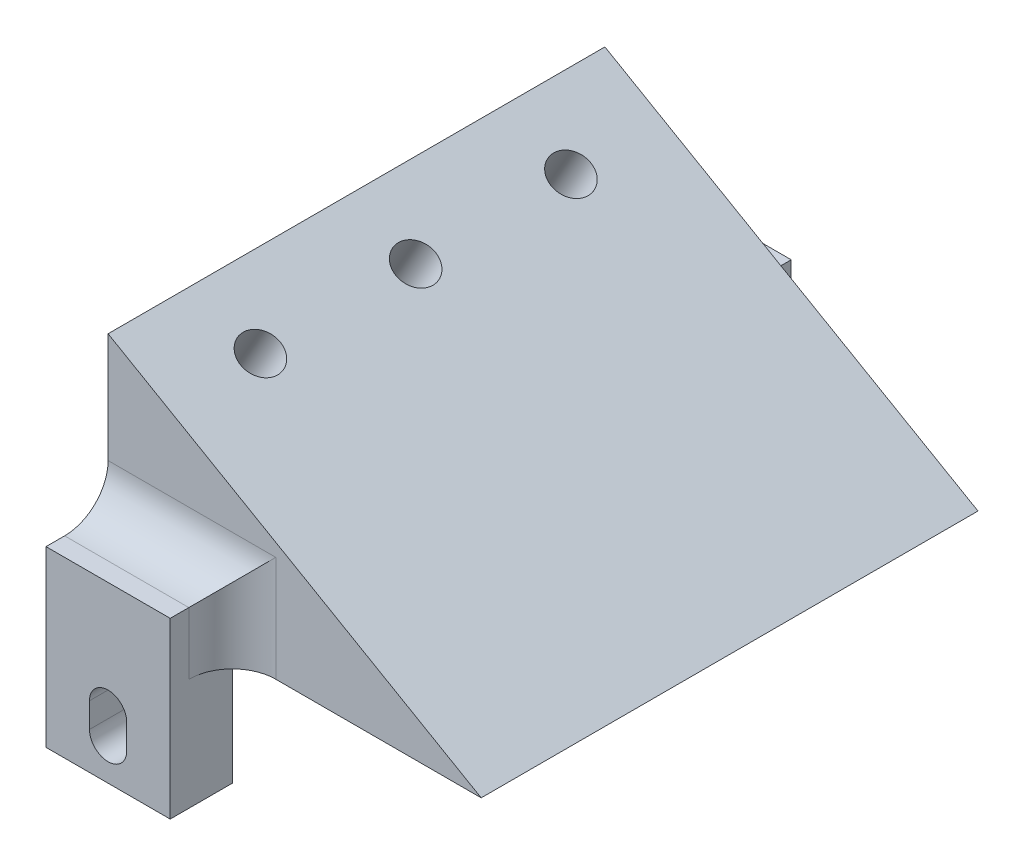
ISO-10303-21;
HEADER;
FILE_DESCRIPTION(('STEP AP214'),'2;1');
FILE_NAME('part.step','',(''),(''),'','','');
FILE_SCHEMA(('AUTOMOTIVE_DESIGN { 1 0 10303 214 1 1 1 1 }'));
ENDSEC;
DATA;
#1=APPLICATION_CONTEXT('core data for automotive mechanical design processes');
#2=APPLICATION_PROTOCOL_DEFINITION('international standard','automotive_design',2000,#1);
#3=PRODUCT_CONTEXT('',#1,'mechanical');
#4=PRODUCT('Part','Part','',(#3));
#5=PRODUCT_RELATED_PRODUCT_CATEGORY('part','',(#4));
#6=PRODUCT_DEFINITION_FORMATION('','',#4);
#7=PRODUCT_DEFINITION_CONTEXT('part definition',#1,'design');
#8=PRODUCT_DEFINITION('design','',#6,#7);
#9=PRODUCT_DEFINITION_SHAPE('','',#8);
#10=(LENGTH_UNIT() NAMED_UNIT(*) SI_UNIT(.MILLI.,.METRE.));
#11=(NAMED_UNIT(*) PLANE_ANGLE_UNIT() SI_UNIT($,.RADIAN.));
#12=(NAMED_UNIT(*) SI_UNIT($,.STERADIAN.) SOLID_ANGLE_UNIT());
#13=UNCERTAINTY_MEASURE_WITH_UNIT(LENGTH_MEASURE(1.E-05),#10,'distance_accuracy_value','');
#14=(GEOMETRIC_REPRESENTATION_CONTEXT(3) GLOBAL_UNCERTAINTY_ASSIGNED_CONTEXT((#13)) GLOBAL_UNIT_ASSIGNED_CONTEXT((#10,
#11,#12)) REPRESENTATION_CONTEXT('',''));
#15=CARTESIAN_POINT('',(0.,0.,0.));
#16=DIRECTION('',(0.,0.,1.));
#17=DIRECTION('',(1.,0.,0.));
#18=AXIS2_PLACEMENT_3D('',#15,#16,#17);
#19=CARTESIAN_POINT('',(0.,0.,0.));
#20=DIRECTION('',(0.,0.,1.));
#21=DIRECTION('',(-1.,0.,0.));
#22=AXIS2_PLACEMENT_3D('',#19,#20,#21);
#23=PLANE('',#22);
#24=DIRECTION('',(1.,0.,0.));
#25=VECTOR('',#24,1.);
#26=CARTESIAN_POINT('',(60.076767482881,0.,0.));
#27=LINE('',#26,#25);
#28=CARTESIAN_POINT('',(0.,0.,0.));
#29=VERTEX_POINT('',#28);
#30=CARTESIAN_POINT('',(20.,0.,0.));
#31=VERTEX_POINT('',#30);
#32=EDGE_CURVE('E331',#29,#31,#27,.T.);
#33=ORIENTED_EDGE('',*,*,#32,.F.);
#34=DIRECTION('',(0.,-1.,0.));
#35=VECTOR('',#34,1.);
#36=CARTESIAN_POINT('',(0.,10.,0.));
#37=LINE('',#36,#35);
#38=CARTESIAN_POINT('',(0.,-18.,0.));
#39=VERTEX_POINT('',#38);
#40=EDGE_CURVE('E241',#29,#39,#37,.T.);
#41=ORIENTED_EDGE('',*,*,#40,.T.);
#42=DIRECTION('',(1.,0.,0.));
#43=VECTOR('',#42,1.);
#44=CARTESIAN_POINT('',(20.,-18.,0.));
#45=LINE('',#44,#43);
#46=CARTESIAN_POINT('',(20.,-18.,0.));
#47=VERTEX_POINT('',#46);
#48=EDGE_CURVE('E246',#39,#47,#45,.T.);
#49=ORIENTED_EDGE('',*,*,#48,.T.);
#50=DIRECTION('',(0.,1.,0.));
#51=VECTOR('',#50,1.);
#52=CARTESIAN_POINT('',(20.,10.,0.));
#53=LINE('',#52,#51);
#54=EDGE_CURVE('E257',#47,#31,#53,.T.);
#55=ORIENTED_EDGE('',*,*,#54,.T.);
#56=EDGE_LOOP('',(#33,#41,#49,#55));
#57=FACE_BOUND('',#56,.T.);
#58=DIRECTION('',(0.,-1.,0.));
#59=VECTOR('',#58,1.);
#60=CARTESIAN_POINT('',(13.,0.,0.));
#61=LINE('',#60,#59);
#62=CARTESIAN_POINT('',(13.,-8.,0.));
#63=VERTEX_POINT('',#62);
#64=CARTESIAN_POINT('',(13.,-12.,0.));
#65=VERTEX_POINT('',#64);
#66=EDGE_CURVE('E235',#63,#65,#61,.T.);
#67=ORIENTED_EDGE('',*,*,#66,.T.);
#68=CARTESIAN_POINT('',(10.,-12.,0.));
#69=DIRECTION('',(0.,0.,1.));
#70=DIRECTION('',(1.,0.,0.));
#71=AXIS2_PLACEMENT_3D('',#68,#69,#70);
#72=CIRCLE('',#71,3.);
#73=CARTESIAN_POINT('',(7.,-12.,0.));
#74=VERTEX_POINT('',#73);
#75=EDGE_CURVE('E238',#65,#74,#72,.F.);
#76=ORIENTED_EDGE('',*,*,#75,.T.);
#77=DIRECTION('',(0.,1.,0.));
#78=VECTOR('',#77,1.);
#79=CARTESIAN_POINT('',(7.,0.,0.));
#80=LINE('',#79,#78);
#81=CARTESIAN_POINT('',(7.,-8.,0.));
#82=VERTEX_POINT('',#81);
#83=EDGE_CURVE('E230',#74,#82,#80,.T.);
#84=ORIENTED_EDGE('',*,*,#83,.T.);
#85=CARTESIAN_POINT('',(10.,-8.,0.));
#86=DIRECTION('',(0.,0.,1.));
#87=DIRECTION('',(1.,0.,0.));
#88=AXIS2_PLACEMENT_3D('',#85,#86,#87);
#89=CIRCLE('',#88,3.);
#90=EDGE_CURVE('E206',#82,#63,#89,.F.);
#91=ORIENTED_EDGE('',*,*,#90,.T.);
#92=EDGE_LOOP('',(#67,#76,#84,#91));
#93=FACE_BOUND('',#92,.T.);
#94=ADVANCED_FACE('F37',(#57,#93),#23,.T.);
#95=CARTESIAN_POINT('',(0.,0.,-10.));
#96=DIRECTION('',(0.,0.,1.));
#97=DIRECTION('',(-1.,0.,0.));
#98=AXIS2_PLACEMENT_3D('',#95,#96,#97);
#99=PLANE('',#98);
#100=DIRECTION('',(0.,-1.,0.));
#101=VECTOR('',#100,1.);
#102=CARTESIAN_POINT('',(0.,10.,-10.));
#103=LINE('',#102,#101);
#104=CARTESIAN_POINT('',(0.,10.,-10.));
#105=VERTEX_POINT('',#104);
#106=CARTESIAN_POINT('',(0.,-18.,-10.));
#107=VERTEX_POINT('',#106);
#108=EDGE_CURVE('E242',#105,#107,#103,.T.);
#109=ORIENTED_EDGE('',*,*,#108,.F.);
#110=DIRECTION('',(-1.,0.,0.));
#111=VECTOR('',#110,1.);
#112=CARTESIAN_POINT('',(20.,10.,-10.));
#113=LINE('',#112,#111);
#114=CARTESIAN_POINT('',(20.,10.,-10.));
#115=VERTEX_POINT('',#114);
#116=EDGE_CURVE('E245',#115,#105,#113,.T.);
#117=ORIENTED_EDGE('',*,*,#116,.F.);
#118=DIRECTION('',(0.,1.,0.));
#119=VECTOR('',#118,1.);
#120=CARTESIAN_POINT('',(20.,10.,-10.));
#121=LINE('',#120,#119);
#122=CARTESIAN_POINT('',(20.,-18.,-10.));
#123=VERTEX_POINT('',#122);
#124=EDGE_CURVE('E249',#123,#115,#121,.T.);
#125=ORIENTED_EDGE('',*,*,#124,.F.);
#126=DIRECTION('',(1.,0.,0.));
#127=VECTOR('',#126,1.);
#128=CARTESIAN_POINT('',(20.,-18.,-10.));
#129=LINE('',#128,#127);
#130=EDGE_CURVE('E252',#107,#123,#129,.T.);
#131=ORIENTED_EDGE('',*,*,#130,.F.);
#132=EDGE_LOOP('',(#109,#117,#125,#131));
#133=FACE_BOUND('',#132,.T.);
#134=CARTESIAN_POINT('',(10.,-12.,-9.99999999999999));
#135=DIRECTION('',(0.,0.,1.));
#136=DIRECTION('',(1.,0.,0.));
#137=AXIS2_PLACEMENT_3D('',#134,#135,#136);
#138=CIRCLE('',#137,3.);
#139=CARTESIAN_POINT('',(7.,-12.,-10.));
#140=VERTEX_POINT('',#139);
#141=CARTESIAN_POINT('',(13.,-12.,-9.99999999999999));
#142=VERTEX_POINT('',#141);
#143=EDGE_CURVE('E219',#140,#142,#138,.T.);
#144=ORIENTED_EDGE('',*,*,#143,.T.);
#145=DIRECTION('',(0.,1.,0.));
#146=VECTOR('',#145,1.);
#147=CARTESIAN_POINT('',(13.,-12.,-9.99999999999999));
#148=LINE('',#147,#146);
#149=CARTESIAN_POINT('',(13.,-8.,-9.99999999999999));
#150=VERTEX_POINT('',#149);
#151=EDGE_CURVE('E223',#142,#150,#148,.T.);
#152=ORIENTED_EDGE('',*,*,#151,.T.);
#153=CARTESIAN_POINT('',(10.,-8.,-9.99999999999999));
#154=DIRECTION('',(0.,0.,1.));
#155=DIRECTION('',(1.,0.,0.));
#156=AXIS2_PLACEMENT_3D('',#153,#154,#155);
#157=CIRCLE('',#156,3.);
#158=CARTESIAN_POINT('',(7.,-8.,-9.99999999999999));
#159=VERTEX_POINT('',#158);
#160=EDGE_CURVE('E203',#150,#159,#157,.T.);
#161=ORIENTED_EDGE('',*,*,#160,.T.);
#162=DIRECTION('',(0.,-1.,0.));
#163=VECTOR('',#162,1.);
#164=CARTESIAN_POINT('',(7.,-12.,-9.99999999999999));
#165=LINE('',#164,#163);
#166=EDGE_CURVE('E214',#159,#140,#165,.T.);
#167=ORIENTED_EDGE('',*,*,#166,.T.);
#168=EDGE_LOOP('',(#144,#152,#161,#167));
#169=FACE_BOUND('',#168,.T.);
#170=ADVANCED_FACE('F221',(#133,#169),#99,.F.);
#171=CARTESIAN_POINT('',(0.,0.,0.));
#172=DIRECTION('',(0.,0.,-1.));
#173=DIRECTION('',(-1.,0.,0.));
#174=AXIS2_PLACEMENT_3D('',#171,#172,#173);
#175=PLANE('',#174);
#176=CARTESIAN_POINT('',(27.,0.,0.));
#177=VERTEX_POINT('',#176);
#178=CARTESIAN_POINT('',(60.076767482881,0.,0.));
#179=VERTEX_POINT('',#178);
#180=EDGE_CURVE('E320',#177,#179,#27,.T.);
#181=ORIENTED_EDGE('',*,*,#180,.F.);
#182=DIRECTION('',(0.,1.,0.));
#183=VECTOR('',#182,1.);
#184=CARTESIAN_POINT('',(27.,10.,0.));
#185=LINE('',#184,#183);
#186=CARTESIAN_POINT('',(27.,17.,0.));
#187=VERTEX_POINT('',#186);
#188=EDGE_CURVE('E373',#177,#187,#185,.T.);
#189=ORIENTED_EDGE('',*,*,#188,.T.);
#190=DIRECTION('',(-1.,0.,0.));
#191=VECTOR('',#190,1.);
#192=CARTESIAN_POINT('',(0.,17.,0.));
#193=LINE('',#192,#191);
#194=CARTESIAN_POINT('',(0.,17.,0.));
#195=VERTEX_POINT('',#194);
#196=EDGE_CURVE('E371',#187,#195,#193,.T.);
#197=ORIENTED_EDGE('',*,*,#196,.T.);
#198=DIRECTION('',(0.,-1.,0.));
#199=VECTOR('',#198,1.);
#200=CARTESIAN_POINT('',(0.,0.,0.));
#201=LINE('',#200,#199);
#202=CARTESIAN_POINT('',(0.,34.6853378782834,0.));
#203=VERTEX_POINT('',#202);
#204=EDGE_CURVE('E335',#203,#195,#201,.T.);
#205=ORIENTED_EDGE('',*,*,#204,.F.);
#206=DIRECTION('',(-0.866025403784442,0.499999999999995,0.));
#207=VECTOR('',#206,1.);
#208=CARTESIAN_POINT('',(0.,34.6853378782834,0.));
#209=LINE('',#208,#207);
#210=EDGE_CURVE('E333',#179,#203,#209,.T.);
#211=ORIENTED_EDGE('',*,*,#210,.F.);
#212=EDGE_LOOP('',(#181,#189,#197,#205,#211));
#213=FACE_BOUND('',#212,.T.);
#214=ADVANCED_FACE('F390',(#213),#175,.T.);
#215=CARTESIAN_POINT('',(0.,0.,80.));
#216=DIRECTION('',(0.,0.,-1.));
#217=DIRECTION('',(-1.,0.,0.));
#218=AXIS2_PLACEMENT_3D('',#215,#216,#217);
#219=PLANE('',#218);
#220=DIRECTION('',(-1.,0.,0.));
#221=VECTOR('',#220,1.);
#222=CARTESIAN_POINT('',(20.,17.,80.));
#223=LINE('',#222,#221);
#224=CARTESIAN_POINT('',(0.,17.,80.));
#225=VERTEX_POINT('',#224);
#226=CARTESIAN_POINT('',(27.,17.,80.));
#227=VERTEX_POINT('',#226);
#228=EDGE_CURVE('E351',#225,#227,#223,.F.);
#229=ORIENTED_EDGE('',*,*,#228,.T.);
#230=DIRECTION('',(0.,1.,0.));
#231=VECTOR('',#230,1.);
#232=CARTESIAN_POINT('',(27.,0.,80.));
#233=LINE('',#232,#231);
#234=CARTESIAN_POINT('',(27.,0.,80.));
#235=VERTEX_POINT('',#234);
#236=EDGE_CURVE('E353',#227,#235,#233,.F.);
#237=ORIENTED_EDGE('',*,*,#236,.T.);
#238=DIRECTION('',(1.,0.,0.));
#239=VECTOR('',#238,1.);
#240=CARTESIAN_POINT('',(60.076767482881,0.,80.));
#241=LINE('',#240,#239);
#242=CARTESIAN_POINT('',(60.076767482881,0.,80.));
#243=VERTEX_POINT('',#242);
#244=EDGE_CURVE('E325',#235,#243,#241,.T.);
#245=ORIENTED_EDGE('',*,*,#244,.T.);
#246=DIRECTION('',(-0.866025403784442,0.499999999999995,0.));
#247=VECTOR('',#246,1.);
#248=CARTESIAN_POINT('',(0.,34.6853378782834,80.));
#249=LINE('',#248,#247);
#250=CARTESIAN_POINT('',(0.,34.6853378782834,80.));
#251=VERTEX_POINT('',#250);
#252=EDGE_CURVE('E324',#243,#251,#249,.T.);
#253=ORIENTED_EDGE('',*,*,#252,.T.);
#254=DIRECTION('',(0.,-1.,0.));
#255=VECTOR('',#254,1.);
#256=CARTESIAN_POINT('',(0.,0.,80.));
#257=LINE('',#256,#255);
#258=EDGE_CURVE('E327',#251,#225,#257,.T.);
#259=ORIENTED_EDGE('',*,*,#258,.T.);
#260=EDGE_LOOP('',(#229,#237,#245,#253,#259));
#261=FACE_BOUND('',#260,.T.);
#262=ADVANCED_FACE('F530',(#261),#219,.F.);
#263=CARTESIAN_POINT('',(60.076767482881,0.,80.));
#264=DIRECTION('',(0.,1.,0.));
#265=DIRECTION('',(0.,0.,1.));
#266=AXIS2_PLACEMENT_3D('',#263,#264,#265);
#267=PLANE('',#266);
#268=ORIENTED_EDGE('',*,*,#32,.T.);
#269=DIRECTION('',(0.,0.,1.));
#270=VECTOR('',#269,1.);
#271=CARTESIAN_POINT('',(20.,0.,-10.));
#272=LINE('',#271,#270);
#273=CARTESIAN_POINT('',(20.,0.,-7.));
#274=VERTEX_POINT('',#273);
#275=EDGE_CURVE('E59',#274,#31,#272,.T.);
#276=ORIENTED_EDGE('',*,*,#275,.F.);
#277=CARTESIAN_POINT('',(27.,0.,-7.));
#278=DIRECTION('',(0.,1.,0.));
#279=DIRECTION('',(0.,0.,1.));
#280=AXIS2_PLACEMENT_3D('',#277,#278,#279);
#281=CIRCLE('',#280,7.);
#282=EDGE_CURVE('E46',#274,#177,#281,.T.);
#283=ORIENTED_EDGE('',*,*,#282,.T.);
#284=ORIENTED_EDGE('',*,*,#180,.T.);
#285=DIRECTION('',(0.,0.,-1.));
#286=VECTOR('',#285,1.);
#287=CARTESIAN_POINT('',(60.076767482881,0.,80.));
#288=LINE('',#287,#286);
#289=EDGE_CURVE('E342',#243,#179,#288,.T.);
#290=ORIENTED_EDGE('',*,*,#289,.F.);
#291=ORIENTED_EDGE('',*,*,#244,.F.);
#292=CARTESIAN_POINT('',(27.,0.,87.));
#293=DIRECTION('',(0.,1.,0.));
#294=DIRECTION('',(0.,0.,1.));
#295=AXIS2_PLACEMENT_3D('',#292,#293,#294);
#296=CIRCLE('',#295,7.);
#297=CARTESIAN_POINT('',(20.,0.,87.));
#298=VERTEX_POINT('',#297);
#299=EDGE_CURVE('E357',#235,#298,#296,.T.);
#300=ORIENTED_EDGE('',*,*,#299,.T.);
#301=DIRECTION('',(0.,0.,1.));
#302=VECTOR('',#301,1.);
#303=CARTESIAN_POINT('',(20.,0.,80.));
#304=LINE('',#303,#302);
#305=CARTESIAN_POINT('',(20.,0.,80.));
#306=VERTEX_POINT('',#305);
#307=EDGE_CURVE('E345',#306,#298,#304,.T.);
#308=ORIENTED_EDGE('',*,*,#307,.F.);
#309=CARTESIAN_POINT('',(0.,0.,80.));
#310=VERTEX_POINT('',#309);
#311=EDGE_CURVE('E321',#310,#306,#241,.T.);
#312=ORIENTED_EDGE('',*,*,#311,.F.);
#313=DIRECTION('',(0.,0.,-1.));
#314=VECTOR('',#313,1.);
#315=CARTESIAN_POINT('',(0.,0.,80.));
#316=LINE('',#315,#314);
#317=EDGE_CURVE('E330',#310,#29,#316,.T.);
#318=ORIENTED_EDGE('',*,*,#317,.T.);
#319=EDGE_LOOP('',(#268,#276,#283,#284,#290,#291,#300,#308,#312,#318));
#320=FACE_BOUND('',#319,.T.);
#321=ADVANCED_FACE('F383',(#320),#267,.F.);
#322=CARTESIAN_POINT('',(0.,34.6853378782834,80.));
#323=DIRECTION('',(-0.499999999999995,-0.866025403784442,0.));
#324=DIRECTION('',(0.866025403784442,-0.499999999999995,0.));
#325=AXIS2_PLACEMENT_3D('',#322,#323,#324);
#326=PLANE('',#325);
#327=CARTESIAN_POINT('',(9.52627944162886,29.1853378782835,15.));
#328=DIRECTION('',(0.499999999999995,0.866025403784442,0.));
#329=DIRECTION('',(-0.866025403784442,0.499999999999995,0.));
#330=AXIS2_PLACEMENT_3D('',#327,#328,#329);
#331=CIRCLE('',#330,3.2);
#332=CARTESIAN_POINT('',(6.75499814951865,30.7853378782835,15.));
#333=VERTEX_POINT('',#332);
#334=EDGE_CURVE('E501',#333,#333,#331,.T.);
#335=ORIENTED_EDGE('',*,*,#334,.F.);
#336=EDGE_LOOP('',(#335));
#337=FACE_BOUND('',#336,.T.);
#338=CARTESIAN_POINT('',(9.52627944162886,29.1853378782835,65.));
#339=DIRECTION('',(0.499999999999995,0.866025403784442,0.));
#340=DIRECTION('',(-0.866025403784442,0.499999999999995,0.));
#341=AXIS2_PLACEMENT_3D('',#338,#339,#340);
#342=CIRCLE('',#341,3.2);
#343=CARTESIAN_POINT('',(6.75499814951865,30.7853378782835,65.));
#344=VERTEX_POINT('',#343);
#345=EDGE_CURVE('E509',#344,#344,#342,.T.);
#346=ORIENTED_EDGE('',*,*,#345,.F.);
#347=EDGE_LOOP('',(#346));
#348=FACE_BOUND('',#347,.T.);
#349=CARTESIAN_POINT('',(9.52627944162887,29.1853378782835,40.));
#350=DIRECTION('',(0.499999999999995,0.866025403784442,0.));
#351=DIRECTION('',(-0.866025403784442,0.499999999999995,0.));
#352=AXIS2_PLACEMENT_3D('',#349,#350,#351);
#353=CIRCLE('',#352,3.2);
#354=CARTESIAN_POINT('',(6.75499814951865,30.7853378782835,40.));
#355=VERTEX_POINT('',#354);
#356=EDGE_CURVE('E515',#355,#355,#353,.T.);
#357=ORIENTED_EDGE('',*,*,#356,.F.);
#358=EDGE_LOOP('',(#357));
#359=FACE_BOUND('',#358,.T.);
#360=ORIENTED_EDGE('',*,*,#210,.T.);
#361=DIRECTION('',(0.,0.,-1.));
#362=VECTOR('',#361,1.);
#363=CARTESIAN_POINT('',(0.,34.6853378782834,80.));
#364=LINE('',#363,#362);
#365=EDGE_CURVE('E339',#251,#203,#364,.T.);
#366=ORIENTED_EDGE('',*,*,#365,.F.);
#367=ORIENTED_EDGE('',*,*,#252,.F.);
#368=ORIENTED_EDGE('',*,*,#289,.T.);
#369=EDGE_LOOP('',(#360,#366,#367,#368));
#370=FACE_BOUND('',#369,.T.);
#371=ADVANCED_FACE('F403',(#337,#348,#359,#370),#326,.F.);
#372=CARTESIAN_POINT('',(0.,0.,80.));
#373=DIRECTION('',(1.,0.,0.));
#374=DIRECTION('',(0.,0.,-1.));
#375=AXIS2_PLACEMENT_3D('',#372,#373,#374);
#376=PLANE('',#375);
#377=ORIENTED_EDGE('',*,*,#204,.T.);
#378=CARTESIAN_POINT('',(0.,17.,-7.));
#379=DIRECTION('',(1.,0.,0.));
#380=DIRECTION('',(0.,0.,-1.));
#381=AXIS2_PLACEMENT_3D('',#378,#379,#380);
#382=CIRCLE('',#381,7.);
#383=CARTESIAN_POINT('',(0.,10.,-7.));
#384=VERTEX_POINT('',#383);
#385=EDGE_CURVE('E11',#195,#384,#382,.T.);
#386=ORIENTED_EDGE('',*,*,#385,.T.);
#387=DIRECTION('',(0.,0.,1.));
#388=VECTOR('',#387,1.);
#389=CARTESIAN_POINT('',(0.,10.,-10.));
#390=LINE('',#389,#388);
#391=EDGE_CURVE('E269',#105,#384,#390,.T.);
#392=ORIENTED_EDGE('',*,*,#391,.F.);
#393=ORIENTED_EDGE('',*,*,#108,.T.);
#394=DIRECTION('',(0.,0.,1.));
#395=VECTOR('',#394,1.);
#396=CARTESIAN_POINT('',(0.,-18.,-10.));
#397=LINE('',#396,#395);
#398=EDGE_CURVE('E255',#107,#39,#397,.T.);
#399=ORIENTED_EDGE('',*,*,#398,.T.);
#400=ORIENTED_EDGE('',*,*,#40,.F.);
#401=ORIENTED_EDGE('',*,*,#317,.F.);
#402=DIRECTION('',(0.,-1.,0.));
#403=VECTOR('',#402,1.);
#404=CARTESIAN_POINT('',(0.,10.,80.));
#405=LINE('',#404,#403);
#406=CARTESIAN_POINT('',(0.,-18.,80.));
#407=VERTEX_POINT('',#406);
#408=EDGE_CURVE('E303',#310,#407,#405,.T.);
#409=ORIENTED_EDGE('',*,*,#408,.T.);
#410=DIRECTION('',(0.,0.,-1.));
#411=VECTOR('',#410,1.);
#412=CARTESIAN_POINT('',(0.,-18.,90.));
#413=LINE('',#412,#411);
#414=CARTESIAN_POINT('',(0.,-18.,90.));
#415=VERTEX_POINT('',#414);
#416=EDGE_CURVE('E317',#415,#407,#413,.T.);
#417=ORIENTED_EDGE('',*,*,#416,.F.);
#418=DIRECTION('',(0.,-1.,0.));
#419=VECTOR('',#418,1.);
#420=CARTESIAN_POINT('',(0.,10.,90.));
#421=LINE('',#420,#419);
#422=CARTESIAN_POINT('',(0.,10.,90.));
#423=VERTEX_POINT('',#422);
#424=EDGE_CURVE('E292',#423,#415,#421,.T.);
#425=ORIENTED_EDGE('',*,*,#424,.F.);
#426=DIRECTION('',(0.,0.,-1.));
#427=VECTOR('',#426,1.);
#428=CARTESIAN_POINT('',(0.,10.,90.));
#429=LINE('',#428,#427);
#430=CARTESIAN_POINT('',(0.,10.,87.));
#431=VERTEX_POINT('',#430);
#432=EDGE_CURVE('E302',#423,#431,#429,.T.);
#433=ORIENTED_EDGE('',*,*,#432,.T.);
#434=CARTESIAN_POINT('',(0.,17.,87.));
#435=DIRECTION('',(1.,0.,0.));
#436=DIRECTION('',(0.,0.,-1.));
#437=AXIS2_PLACEMENT_3D('',#434,#435,#436);
#438=CIRCLE('',#437,7.);
#439=EDGE_CURVE('E359',#431,#225,#438,.T.);
#440=ORIENTED_EDGE('',*,*,#439,.T.);
#441=ORIENTED_EDGE('',*,*,#258,.F.);
#442=ORIENTED_EDGE('',*,*,#365,.T.);
#443=EDGE_LOOP('',(#377,#386,#392,#393,#399,#400,#401,#409,#417,#425,#433,#440,#441,#442));
#444=FACE_BOUND('',#443,.T.);
#445=ADVANCED_FACE('F398',(#444),#376,.F.);
#446=CARTESIAN_POINT('',(20.,-18.,90.));
#447=DIRECTION('',(0.,1.,0.));
#448=DIRECTION('',(-1.,0.,0.));
#449=AXIS2_PLACEMENT_3D('',#446,#447,#448);
#450=PLANE('',#449);
#451=DIRECTION('',(1.,0.,0.));
#452=VECTOR('',#451,1.);
#453=CARTESIAN_POINT('',(20.,-18.,80.));
#454=LINE('',#453,#452);
#455=CARTESIAN_POINT('',(20.,-18.,80.));
#456=VERTEX_POINT('',#455);
#457=EDGE_CURVE('E305',#407,#456,#454,.T.);
#458=ORIENTED_EDGE('',*,*,#457,.T.);
#459=DIRECTION('',(0.,0.,-1.));
#460=VECTOR('',#459,1.);
#461=CARTESIAN_POINT('',(20.,-18.,90.));
#462=LINE('',#461,#460);
#463=CARTESIAN_POINT('',(20.,-18.,90.));
#464=VERTEX_POINT('',#463);
#465=EDGE_CURVE('E314',#464,#456,#462,.T.);
#466=ORIENTED_EDGE('',*,*,#465,.F.);
#467=DIRECTION('',(1.,0.,0.));
#468=VECTOR('',#467,1.);
#469=CARTESIAN_POINT('',(20.,-18.,90.));
#470=LINE('',#469,#468);
#471=EDGE_CURVE('E295',#415,#464,#470,.T.);
#472=ORIENTED_EDGE('',*,*,#471,.F.);
#473=ORIENTED_EDGE('',*,*,#416,.T.);
#474=EDGE_LOOP('',(#458,#466,#472,#473));
#475=FACE_BOUND('',#474,.T.);
#476=ADVANCED_FACE('F528',(#475),#450,.F.);
#477=CARTESIAN_POINT('',(20.,10.,90.));
#478=DIRECTION('',(-1.,0.,0.));
#479=DIRECTION('',(0.,-1.,0.));
#480=AXIS2_PLACEMENT_3D('',#477,#478,#479);
#481=PLANE('',#480);
#482=ORIENTED_EDGE('',*,*,#307,.T.);
#483=DIRECTION('',(0.,1.,0.));
#484=VECTOR('',#483,1.);
#485=CARTESIAN_POINT('',(20.,10.,87.));
#486=LINE('',#485,#484);
#487=CARTESIAN_POINT('',(20.,10.,87.));
#488=VERTEX_POINT('',#487);
#489=EDGE_CURVE('E348',#298,#488,#486,.T.);
#490=ORIENTED_EDGE('',*,*,#489,.T.);
#491=DIRECTION('',(0.,0.,-1.));
#492=VECTOR('',#491,1.);
#493=CARTESIAN_POINT('',(20.,10.,90.));
#494=LINE('',#493,#492);
#495=CARTESIAN_POINT('',(20.,10.,90.));
#496=VERTEX_POINT('',#495);
#497=EDGE_CURVE('E311',#496,#488,#494,.T.);
#498=ORIENTED_EDGE('',*,*,#497,.F.);
#499=DIRECTION('',(0.,1.,0.));
#500=VECTOR('',#499,1.);
#501=CARTESIAN_POINT('',(20.,10.,90.));
#502=LINE('',#501,#500);
#503=EDGE_CURVE('E298',#464,#496,#502,.T.);
#504=ORIENTED_EDGE('',*,*,#503,.F.);
#505=ORIENTED_EDGE('',*,*,#465,.T.);
#506=DIRECTION('',(0.,1.,0.));
#507=VECTOR('',#506,1.);
#508=CARTESIAN_POINT('',(20.,10.,80.));
#509=LINE('',#508,#507);
#510=EDGE_CURVE('E296',#456,#306,#509,.T.);
#511=ORIENTED_EDGE('',*,*,#510,.T.);
#512=EDGE_LOOP('',(#482,#490,#498,#504,#505,#511));
#513=FACE_BOUND('',#512,.T.);
#514=ADVANCED_FACE('F415',(#513),#481,.F.);
#515=CARTESIAN_POINT('',(20.,10.,90.));
#516=DIRECTION('',(0.,-1.,0.));
#517=DIRECTION('',(1.,0.,0.));
#518=AXIS2_PLACEMENT_3D('',#515,#516,#517);
#519=PLANE('',#518);
#520=ORIENTED_EDGE('',*,*,#497,.T.);
#521=DIRECTION('',(-1.,0.,0.));
#522=VECTOR('',#521,1.);
#523=CARTESIAN_POINT('',(0.,10.,87.));
#524=LINE('',#523,#522);
#525=EDGE_CURVE('E355',#488,#431,#524,.T.);
#526=ORIENTED_EDGE('',*,*,#525,.T.);
#527=ORIENTED_EDGE('',*,*,#432,.F.);
#528=DIRECTION('',(-1.,0.,0.));
#529=VECTOR('',#528,1.);
#530=CARTESIAN_POINT('',(20.,10.,90.));
#531=LINE('',#530,#529);
#532=EDGE_CURVE('E300',#496,#423,#531,.T.);
#533=ORIENTED_EDGE('',*,*,#532,.F.);
#534=EDGE_LOOP('',(#520,#526,#527,#533));
#535=FACE_BOUND('',#534,.T.);
#536=ADVANCED_FACE('F419',(#535),#519,.F.);
#537=CARTESIAN_POINT('',(0.,0.,90.));
#538=DIRECTION('',(0.,0.,-1.));
#539=DIRECTION('',(-1.,0.,0.));
#540=AXIS2_PLACEMENT_3D('',#537,#538,#539);
#541=PLANE('',#540);
#542=DIRECTION('',(0.,1.,0.));
#543=VECTOR('',#542,1.);
#544=CARTESIAN_POINT('',(13.,-12.,90.));
#545=LINE('',#544,#543);
#546=CARTESIAN_POINT('',(13.,-12.,90.));
#547=VERTEX_POINT('',#546);
#548=CARTESIAN_POINT('',(13.,-8.,90.));
#549=VERTEX_POINT('',#548);
#550=EDGE_CURVE('E273',#547,#549,#545,.T.);
#551=ORIENTED_EDGE('',*,*,#550,.F.);
#552=CARTESIAN_POINT('',(10.,-12.,90.));
#553=DIRECTION('',(0.,0.,1.));
#554=DIRECTION('',(1.,0.,0.));
#555=AXIS2_PLACEMENT_3D('',#552,#553,#554);
#556=CIRCLE('',#555,3.);
#557=CARTESIAN_POINT('',(7.,-12.,90.));
#558=VERTEX_POINT('',#557);
#559=EDGE_CURVE('E271',#558,#547,#556,.T.);
#560=ORIENTED_EDGE('',*,*,#559,.F.);
#561=DIRECTION('',(0.,-1.,0.));
#562=VECTOR('',#561,1.);
#563=CARTESIAN_POINT('',(7.,-12.,90.));
#564=LINE('',#563,#562);
#565=CARTESIAN_POINT('',(7.,-8.,90.));
#566=VERTEX_POINT('',#565);
#567=EDGE_CURVE('E279',#566,#558,#564,.T.);
#568=ORIENTED_EDGE('',*,*,#567,.F.);
#569=CARTESIAN_POINT('',(10.,-8.,90.));
#570=DIRECTION('',(0.,0.,1.));
#571=DIRECTION('',(1.,0.,0.));
#572=AXIS2_PLACEMENT_3D('',#569,#570,#571);
#573=CIRCLE('',#572,3.);
#574=EDGE_CURVE('E276',#549,#566,#573,.T.);
#575=ORIENTED_EDGE('',*,*,#574,.F.);
#576=EDGE_LOOP('',(#551,#560,#568,#575));
#577=FACE_BOUND('',#576,.T.);
#578=ORIENTED_EDGE('',*,*,#424,.T.);
#579=ORIENTED_EDGE('',*,*,#471,.T.);
#580=ORIENTED_EDGE('',*,*,#503,.T.);
#581=ORIENTED_EDGE('',*,*,#532,.T.);
#582=EDGE_LOOP('',(#578,#579,#580,#581));
#583=FACE_BOUND('',#582,.T.);
#584=ADVANCED_FACE('F423',(#577,#583),#541,.F.);
#585=CARTESIAN_POINT('',(0.,0.,80.));
#586=DIRECTION('',(0.,0.,-1.));
#587=DIRECTION('',(-1.,0.,0.));
#588=AXIS2_PLACEMENT_3D('',#585,#586,#587);
#589=PLANE('',#588);
#590=CARTESIAN_POINT('',(10.,-12.,80.));
#591=DIRECTION('',(0.,0.,-1.));
#592=DIRECTION('',(-1.,0.,0.));
#593=AXIS2_PLACEMENT_3D('',#590,#591,#592);
#594=CIRCLE('',#593,3.);
#595=CARTESIAN_POINT('',(13.,-12.,80.));
#596=VERTEX_POINT('',#595);
#597=CARTESIAN_POINT('',(7.,-12.,80.));
#598=VERTEX_POINT('',#597);
#599=EDGE_CURVE('E369',#596,#598,#594,.T.);
#600=ORIENTED_EDGE('',*,*,#599,.F.);
#601=DIRECTION('',(0.,-1.,0.));
#602=VECTOR('',#601,1.);
#603=CARTESIAN_POINT('',(13.,0.,80.));
#604=LINE('',#603,#602);
#605=CARTESIAN_POINT('',(13.,-8.,80.));
#606=VERTEX_POINT('',#605);
#607=EDGE_CURVE('E361',#606,#596,#604,.T.);
#608=ORIENTED_EDGE('',*,*,#607,.F.);
#609=CARTESIAN_POINT('',(10.,-8.,80.));
#610=DIRECTION('',(0.,0.,-1.));
#611=DIRECTION('',(-1.,0.,0.));
#612=AXIS2_PLACEMENT_3D('',#609,#610,#611);
#613=CIRCLE('',#612,3.);
#614=CARTESIAN_POINT('',(7.,-8.,80.));
#615=VERTEX_POINT('',#614);
#616=EDGE_CURVE('E364',#615,#606,#613,.T.);
#617=ORIENTED_EDGE('',*,*,#616,.F.);
#618=DIRECTION('',(0.,1.,0.));
#619=VECTOR('',#618,1.);
#620=CARTESIAN_POINT('',(7.,0.,80.));
#621=LINE('',#620,#619);
#622=EDGE_CURVE('E367',#598,#615,#621,.T.);
#623=ORIENTED_EDGE('',*,*,#622,.F.);
#624=EDGE_LOOP('',(#600,#608,#617,#623));
#625=FACE_BOUND('',#624,.T.);
#626=ORIENTED_EDGE('',*,*,#408,.F.);
#627=ORIENTED_EDGE('',*,*,#311,.T.);
#628=ORIENTED_EDGE('',*,*,#510,.F.);
#629=ORIENTED_EDGE('',*,*,#457,.F.);
#630=EDGE_LOOP('',(#626,#627,#628,#629));
#631=FACE_BOUND('',#630,.T.);
#632=ADVANCED_FACE('F431',(#625,#631),#589,.T.);
#633=CARTESIAN_POINT('',(20.,17.,87.));
#634=DIRECTION('',(1.,0.,0.));
#635=DIRECTION('',(0.,1.,0.));
#636=AXIS2_PLACEMENT_3D('',#633,#634,#635);
#637=CYLINDRICAL_SURFACE('',#636,7.);
#638=ORIENTED_EDGE('',*,*,#439,.F.);
#639=ORIENTED_EDGE('',*,*,#525,.F.);
#640=CARTESIAN_POINT('',(27.,17.,87.));
#641=DIRECTION('',(0.707106781186548,-0.707106781186547,0.));
#642=DIRECTION('',(0.707106781186547,0.707106781186548,0.));
#643=AXIS2_PLACEMENT_3D('',#640,#641,#642);
#644=ELLIPSE('',#643,9.89949493661167,7.);
#645=EDGE_CURVE('E285',#227,#488,#644,.F.);
#646=ORIENTED_EDGE('',*,*,#645,.F.);
#647=ORIENTED_EDGE('',*,*,#228,.F.);
#648=EDGE_LOOP('',(#638,#639,#646,#647));
#649=FACE_BOUND('',#648,.T.);
#650=ADVANCED_FACE('F539',(#649),#637,.F.);
#651=CARTESIAN_POINT('',(27.,10.,87.));
#652=DIRECTION('',(0.,-1.,0.));
#653=DIRECTION('',(1.,0.,0.));
#654=AXIS2_PLACEMENT_3D('',#651,#652,#653);
#655=CYLINDRICAL_SURFACE('',#654,7.);
#656=ORIENTED_EDGE('',*,*,#299,.F.);
#657=ORIENTED_EDGE('',*,*,#236,.F.);
#658=ORIENTED_EDGE('',*,*,#645,.T.);
#659=ORIENTED_EDGE('',*,*,#489,.F.);
#660=EDGE_LOOP('',(#656,#657,#658,#659));
#661=FACE_BOUND('',#660,.T.);
#662=ADVANCED_FACE('F410',(#661),#655,.F.);
#663=CARTESIAN_POINT('',(10.,-12.,70.));
#664=DIRECTION('',(0.,0.,1.));
#665=DIRECTION('',(1.,0.,0.));
#666=AXIS2_PLACEMENT_3D('',#663,#664,#665);
#667=CYLINDRICAL_SURFACE('',#666,3.);
#668=ORIENTED_EDGE('',*,*,#599,.T.);
#669=DIRECTION('',(0.,0.,1.));
#670=VECTOR('',#669,1.);
#671=CARTESIAN_POINT('',(7.,-12.,70.));
#672=LINE('',#671,#670);
#673=EDGE_CURVE('E283',#598,#558,#672,.T.);
#674=ORIENTED_EDGE('',*,*,#673,.T.);
#675=ORIENTED_EDGE('',*,*,#559,.T.);
#676=DIRECTION('',(0.,0.,1.));
#677=VECTOR('',#676,1.);
#678=CARTESIAN_POINT('',(13.,-12.,70.));
#679=LINE('',#678,#677);
#680=EDGE_CURVE('E282',#596,#547,#679,.T.);
#681=ORIENTED_EDGE('',*,*,#680,.F.);
#682=EDGE_LOOP('',(#668,#674,#675,#681));
#683=FACE_BOUND('',#682,.T.);
#684=ADVANCED_FACE('F538',(#683),#667,.F.);
#685=CARTESIAN_POINT('',(7.,-12.,70.));
#686=DIRECTION('',(-1.,0.,0.));
#687=DIRECTION('',(0.,0.,1.));
#688=AXIS2_PLACEMENT_3D('',#685,#686,#687);
#689=PLANE('',#688);
#690=ORIENTED_EDGE('',*,*,#622,.T.);
#691=DIRECTION('',(0.,0.,1.));
#692=VECTOR('',#691,1.);
#693=CARTESIAN_POINT('',(7.,-8.,70.));
#694=LINE('',#693,#692);
#695=EDGE_CURVE('E286',#615,#566,#694,.T.);
#696=ORIENTED_EDGE('',*,*,#695,.T.);
#697=ORIENTED_EDGE('',*,*,#567,.T.);
#698=ORIENTED_EDGE('',*,*,#673,.F.);
#699=EDGE_LOOP('',(#690,#696,#697,#698));
#700=FACE_BOUND('',#699,.T.);
#701=ADVANCED_FACE('F604',(#700),#689,.F.);
#702=CARTESIAN_POINT('',(10.,-8.,70.));
#703=DIRECTION('',(0.,0.,1.));
#704=DIRECTION('',(1.,0.,0.));
#705=AXIS2_PLACEMENT_3D('',#702,#703,#704);
#706=CYLINDRICAL_SURFACE('',#705,3.);
#707=ORIENTED_EDGE('',*,*,#616,.T.);
#708=DIRECTION('',(0.,0.,1.));
#709=VECTOR('',#708,1.);
#710=CARTESIAN_POINT('',(13.,-8.,70.));
#711=LINE('',#710,#709);
#712=EDGE_CURVE('E288',#606,#549,#711,.T.);
#713=ORIENTED_EDGE('',*,*,#712,.T.);
#714=ORIENTED_EDGE('',*,*,#574,.T.);
#715=ORIENTED_EDGE('',*,*,#695,.F.);
#716=EDGE_LOOP('',(#707,#713,#714,#715));
#717=FACE_BOUND('',#716,.T.);
#718=ADVANCED_FACE('F592',(#717),#706,.F.);
#719=CARTESIAN_POINT('',(13.,-12.,70.));
#720=DIRECTION('',(1.,0.,0.));
#721=DIRECTION('',(0.,0.,-1.));
#722=AXIS2_PLACEMENT_3D('',#719,#720,#721);
#723=PLANE('',#722);
#724=ORIENTED_EDGE('',*,*,#607,.T.);
#725=ORIENTED_EDGE('',*,*,#680,.T.);
#726=ORIENTED_EDGE('',*,*,#550,.T.);
#727=ORIENTED_EDGE('',*,*,#712,.F.);
#728=EDGE_LOOP('',(#724,#725,#726,#727));
#729=FACE_BOUND('',#728,.T.);
#730=ADVANCED_FACE('F587',(#729),#723,.F.);
#731=CARTESIAN_POINT('',(20.,10.,-10.));
#732=DIRECTION('',(0.,1.,0.));
#733=DIRECTION('',(-1.,0.,0.));
#734=AXIS2_PLACEMENT_3D('',#731,#732,#733);
#735=PLANE('',#734);
#736=ORIENTED_EDGE('',*,*,#391,.T.);
#737=DIRECTION('',(-1.,0.,0.));
#738=VECTOR('',#737,1.);
#739=CARTESIAN_POINT('',(20.,10.,-7.));
#740=LINE('',#739,#738);
#741=CARTESIAN_POINT('',(20.,10.,-7.));
#742=VERTEX_POINT('',#741);
#743=EDGE_CURVE('E379',#384,#742,#740,.F.);
#744=ORIENTED_EDGE('',*,*,#743,.T.);
#745=DIRECTION('',(0.,0.,1.));
#746=VECTOR('',#745,1.);
#747=CARTESIAN_POINT('',(20.,10.,-10.));
#748=LINE('',#747,#746);
#749=EDGE_CURVE('E266',#115,#742,#748,.T.);
#750=ORIENTED_EDGE('',*,*,#749,.F.);
#751=ORIENTED_EDGE('',*,*,#116,.T.);
#752=EDGE_LOOP('',(#736,#744,#750,#751));
#753=FACE_BOUND('',#752,.T.);
#754=ADVANCED_FACE('F443',(#753),#735,.T.);
#755=CARTESIAN_POINT('',(20.,10.,-10.));
#756=DIRECTION('',(1.,0.,0.));
#757=DIRECTION('',(0.,1.,0.));
#758=AXIS2_PLACEMENT_3D('',#755,#756,#757);
#759=PLANE('',#758);
#760=ORIENTED_EDGE('',*,*,#749,.T.);
#761=DIRECTION('',(0.,1.,0.));
#762=VECTOR('',#761,1.);
#763=CARTESIAN_POINT('',(20.,0.,-7.));
#764=LINE('',#763,#762);
#765=EDGE_CURVE('E377',#742,#274,#764,.F.);
#766=ORIENTED_EDGE('',*,*,#765,.T.);
#767=ORIENTED_EDGE('',*,*,#275,.T.);
#768=ORIENTED_EDGE('',*,*,#54,.F.);
#769=DIRECTION('',(0.,0.,1.));
#770=VECTOR('',#769,1.);
#771=CARTESIAN_POINT('',(20.,-18.,-10.));
#772=LINE('',#771,#770);
#773=EDGE_CURVE('E264',#123,#47,#772,.T.);
#774=ORIENTED_EDGE('',*,*,#773,.F.);
#775=ORIENTED_EDGE('',*,*,#124,.T.);
#776=EDGE_LOOP('',(#760,#766,#767,#768,#774,#775));
#777=FACE_BOUND('',#776,.T.);
#778=ADVANCED_FACE('F439',(#777),#759,.T.);
#779=CARTESIAN_POINT('',(20.,-18.,-10.));
#780=DIRECTION('',(0.,-1.,0.));
#781=DIRECTION('',(1.,0.,0.));
#782=AXIS2_PLACEMENT_3D('',#779,#780,#781);
#783=PLANE('',#782);
#784=ORIENTED_EDGE('',*,*,#48,.F.);
#785=ORIENTED_EDGE('',*,*,#398,.F.);
#786=ORIENTED_EDGE('',*,*,#130,.T.);
#787=ORIENTED_EDGE('',*,*,#773,.T.);
#788=EDGE_LOOP('',(#784,#785,#786,#787));
#789=FACE_BOUND('',#788,.T.);
#790=ADVANCED_FACE('F448',(#789),#783,.T.);
#791=CARTESIAN_POINT('',(10.,-12.,10.));
#792=DIRECTION('',(0.,0.,-1.));
#793=DIRECTION('',(-1.,0.,0.));
#794=AXIS2_PLACEMENT_3D('',#791,#792,#793);
#795=CYLINDRICAL_SURFACE('',#794,3.);
#796=DIRECTION('',(0.,0.,-1.));
#797=VECTOR('',#796,1.);
#798=CARTESIAN_POINT('',(13.,-12.,10.));
#799=LINE('',#798,#797);
#800=EDGE_CURVE('E228',#65,#142,#799,.T.);
#801=ORIENTED_EDGE('',*,*,#800,.T.);
#802=ORIENTED_EDGE('',*,*,#143,.F.);
#803=DIRECTION('',(0.,0.,-1.));
#804=VECTOR('',#803,1.);
#805=CARTESIAN_POINT('',(7.,-12.,10.));
#806=LINE('',#805,#804);
#807=EDGE_CURVE('E210',#74,#140,#806,.T.);
#808=ORIENTED_EDGE('',*,*,#807,.F.);
#809=ORIENTED_EDGE('',*,*,#75,.F.);
#810=EDGE_LOOP('',(#801,#802,#808,#809));
#811=FACE_BOUND('',#810,.T.);
#812=ADVANCED_FACE('F450',(#811),#795,.F.);
#813=CARTESIAN_POINT('',(13.,-12.,10.));
#814=DIRECTION('',(-1.,0.,0.));
#815=DIRECTION('',(0.,0.,1.));
#816=AXIS2_PLACEMENT_3D('',#813,#814,#815);
#817=PLANE('',#816);
#818=DIRECTION('',(0.,0.,-1.));
#819=VECTOR('',#818,1.);
#820=CARTESIAN_POINT('',(13.,-8.,10.));
#821=LINE('',#820,#819);
#822=EDGE_CURVE('E209',#63,#150,#821,.T.);
#823=ORIENTED_EDGE('',*,*,#822,.T.);
#824=ORIENTED_EDGE('',*,*,#151,.F.);
#825=ORIENTED_EDGE('',*,*,#800,.F.);
#826=ORIENTED_EDGE('',*,*,#66,.F.);
#827=EDGE_LOOP('',(#823,#824,#825,#826));
#828=FACE_BOUND('',#827,.T.);
#829=ADVANCED_FACE('F456',(#828),#817,.T.);
#830=CARTESIAN_POINT('',(10.,-8.,10.));
#831=DIRECTION('',(0.,0.,-1.));
#832=DIRECTION('',(-1.,0.,0.));
#833=AXIS2_PLACEMENT_3D('',#830,#831,#832);
#834=CYLINDRICAL_SURFACE('',#833,3.);
#835=DIRECTION('',(0.,0.,-1.));
#836=VECTOR('',#835,1.);
#837=CARTESIAN_POINT('',(7.,-8.,10.));
#838=LINE('',#837,#836);
#839=EDGE_CURVE('E198',#82,#159,#838,.T.);
#840=ORIENTED_EDGE('',*,*,#839,.T.);
#841=ORIENTED_EDGE('',*,*,#160,.F.);
#842=ORIENTED_EDGE('',*,*,#822,.F.);
#843=ORIENTED_EDGE('',*,*,#90,.F.);
#844=EDGE_LOOP('',(#840,#841,#842,#843));
#845=FACE_BOUND('',#844,.T.);
#846=ADVANCED_FACE('F200',(#845),#834,.F.);
#847=CARTESIAN_POINT('',(7.,-12.,10.));
#848=DIRECTION('',(1.,0.,0.));
#849=DIRECTION('',(0.,0.,-1.));
#850=AXIS2_PLACEMENT_3D('',#847,#848,#849);
#851=PLANE('',#850);
#852=ORIENTED_EDGE('',*,*,#807,.T.);
#853=ORIENTED_EDGE('',*,*,#166,.F.);
#854=ORIENTED_EDGE('',*,*,#839,.F.);
#855=ORIENTED_EDGE('',*,*,#83,.F.);
#856=EDGE_LOOP('',(#852,#853,#854,#855));
#857=FACE_BOUND('',#856,.T.);
#858=ADVANCED_FACE('F215',(#857),#851,.T.);
#859=CARTESIAN_POINT('',(0.,17.,-7.));
#860=DIRECTION('',(1.,0.,0.));
#861=DIRECTION('',(0.,1.,0.));
#862=AXIS2_PLACEMENT_3D('',#859,#860,#861);
#863=CYLINDRICAL_SURFACE('',#862,7.);
#864=ORIENTED_EDGE('',*,*,#385,.F.);
#865=ORIENTED_EDGE('',*,*,#196,.F.);
#866=CARTESIAN_POINT('',(27.,17.,-7.));
#867=DIRECTION('',(0.707106781186548,-0.707106781186547,0.));
#868=DIRECTION('',(0.707106781186547,0.707106781186548,0.));
#869=AXIS2_PLACEMENT_3D('',#866,#867,#868);
#870=ELLIPSE('',#869,9.89949493661167,7.);
#871=EDGE_CURVE('E41',#742,#187,#870,.F.);
#872=ORIENTED_EDGE('',*,*,#871,.F.);
#873=ORIENTED_EDGE('',*,*,#743,.F.);
#874=EDGE_LOOP('',(#864,#865,#872,#873));
#875=FACE_BOUND('',#874,.T.);
#876=ADVANCED_FACE('F39',(#875),#863,.F.);
#877=CARTESIAN_POINT('',(27.,0.,-7.));
#878=DIRECTION('',(0.,-1.,0.));
#879=DIRECTION('',(1.,0.,0.));
#880=AXIS2_PLACEMENT_3D('',#877,#878,#879);
#881=CYLINDRICAL_SURFACE('',#880,7.);
#882=ORIENTED_EDGE('',*,*,#282,.F.);
#883=ORIENTED_EDGE('',*,*,#765,.F.);
#884=ORIENTED_EDGE('',*,*,#871,.T.);
#885=ORIENTED_EDGE('',*,*,#188,.F.);
#886=EDGE_LOOP('',(#882,#883,#884,#885));
#887=FACE_BOUND('',#886,.T.);
#888=ADVANCED_FACE('F392',(#887),#881,.F.);
#889=CARTESIAN_POINT('',(4.77627944162892,20.9580965423313,40.));
#890=DIRECTION('',(0.499999999999995,0.866025403784442,0.));
#891=DIRECTION('',(-0.866025403784442,0.499999999999995,0.));
#892=AXIS2_PLACEMENT_3D('',#889,#890,#891);
#893=CYLINDRICAL_SURFACE('',#892,3.2);
#894=CARTESIAN_POINT('',(4.77627944162892,20.9580965423313,40.));
#895=DIRECTION('',(0.499999999999995,0.866025403784442,0.));
#896=DIRECTION('',(-0.866025403784442,0.499999999999995,0.));
#897=AXIS2_PLACEMENT_3D('',#894,#895,#896);
#898=CIRCLE('',#897,3.2);
#899=CARTESIAN_POINT('',(2.0049981495187,22.5580965423313,40.));
#900=VERTEX_POINT('',#899);
#901=EDGE_CURVE('E512',#900,#900,#898,.T.);
#902=ORIENTED_EDGE('',*,*,#901,.F.);
#903=EDGE_LOOP('',(#902));
#904=FACE_BOUND('',#903,.T.);
#905=ORIENTED_EDGE('',*,*,#356,.T.);
#906=EDGE_LOOP('',(#905));
#907=FACE_BOUND('',#906,.T.);
#908=ADVANCED_FACE('F474',(#904,#907),#893,.F.);
#909=CARTESIAN_POINT('',(4.77627944162892,20.9580965423313,40.));
#910=DIRECTION('',(0.499999999999995,0.866025403784442,0.));
#911=DIRECTION('',(-0.866025403784442,0.499999999999995,0.));
#912=AXIS2_PLACEMENT_3D('',#909,#910,#911);
#913=PLANE('',#912);
#914=ORIENTED_EDGE('',*,*,#901,.T.);
#915=EDGE_LOOP('',(#914));
#916=FACE_BOUND('',#915,.T.);
#917=ADVANCED_FACE('F477',(#916),#913,.T.);
#918=CARTESIAN_POINT('',(4.77627944162892,20.9580965423313,65.));
#919=DIRECTION('',(0.499999999999995,0.866025403784442,0.));
#920=DIRECTION('',(-0.866025403784442,0.499999999999995,0.));
#921=AXIS2_PLACEMENT_3D('',#918,#919,#920);
#922=CYLINDRICAL_SURFACE('',#921,3.2);
#923=CARTESIAN_POINT('',(4.77627944162892,20.9580965423313,65.));
#924=DIRECTION('',(0.499999999999995,0.866025403784442,0.));
#925=DIRECTION('',(-0.866025403784442,0.499999999999995,0.));
#926=AXIS2_PLACEMENT_3D('',#923,#924,#925);
#927=CIRCLE('',#926,3.2);
#928=CARTESIAN_POINT('',(2.0049981495187,22.5580965423313,65.));
#929=VERTEX_POINT('',#928);
#930=EDGE_CURVE('E504',#929,#929,#927,.T.);
#931=ORIENTED_EDGE('',*,*,#930,.F.);
#932=EDGE_LOOP('',(#931));
#933=FACE_BOUND('',#932,.T.);
#934=ORIENTED_EDGE('',*,*,#345,.T.);
#935=EDGE_LOOP('',(#934));
#936=FACE_BOUND('',#935,.T.);
#937=ADVANCED_FACE('F481',(#933,#936),#922,.F.);
#938=CARTESIAN_POINT('',(4.77627944162892,20.9580965423313,65.));
#939=DIRECTION('',(0.499999999999995,0.866025403784442,0.));
#940=DIRECTION('',(-0.866025403784442,0.499999999999995,0.));
#941=AXIS2_PLACEMENT_3D('',#938,#939,#940);
#942=PLANE('',#941);
#943=ORIENTED_EDGE('',*,*,#930,.T.);
#944=EDGE_LOOP('',(#943));
#945=FACE_BOUND('',#944,.T.);
#946=ADVANCED_FACE('F485',(#945),#942,.T.);
#947=CARTESIAN_POINT('',(4.77627944162892,20.9580965423313,15.));
#948=DIRECTION('',(0.499999999999995,0.866025403784442,0.));
#949=DIRECTION('',(-0.866025403784442,0.499999999999995,0.));
#950=AXIS2_PLACEMENT_3D('',#947,#948,#949);
#951=CYLINDRICAL_SURFACE('',#950,3.2);
#952=CARTESIAN_POINT('',(4.77627944162892,20.9580965423313,15.));
#953=DIRECTION('',(0.499999999999995,0.866025403784442,0.));
#954=DIRECTION('',(-0.866025403784442,0.499999999999995,0.));
#955=AXIS2_PLACEMENT_3D('',#952,#953,#954);
#956=CIRCLE('',#955,3.2);
#957=CARTESIAN_POINT('',(2.0049981495187,22.5580965423313,15.));
#958=VERTEX_POINT('',#957);
#959=EDGE_CURVE('E397',#958,#958,#956,.T.);
#960=ORIENTED_EDGE('',*,*,#959,.F.);
#961=EDGE_LOOP('',(#960));
#962=FACE_BOUND('',#961,.T.);
#963=ORIENTED_EDGE('',*,*,#334,.T.);
#964=EDGE_LOOP('',(#963));
#965=FACE_BOUND('',#964,.T.);
#966=ADVANCED_FACE('F489',(#962,#965),#951,.F.);
#967=CARTESIAN_POINT('',(4.77627944162892,20.9580965423313,15.));
#968=DIRECTION('',(0.499999999999995,0.866025403784442,0.));
#969=DIRECTION('',(-0.866025403784442,0.499999999999995,0.));
#970=AXIS2_PLACEMENT_3D('',#967,#968,#969);
#971=PLANE('',#970);
#972=ORIENTED_EDGE('',*,*,#959,.T.);
#973=EDGE_LOOP('',(#972));
#974=FACE_BOUND('',#973,.T.);
#975=ADVANCED_FACE('F493',(#974),#971,.T.);
#976=CLOSED_SHELL('',(#94,#170,#214,#262,#321,#371,#445,#476,#514,#536,#584,#632,#650,#662,#684,
#701,#718,#730,#754,#778,#790,#812,#829,#846,#858,#876,#888,#908,#917,#937,#946,#966,#975));
#977=MANIFOLD_SOLID_BREP('B2',#976);
#978=ADVANCED_BREP_SHAPE_REPRESENTATION('',(#18,#977),#14);
#979=SHAPE_DEFINITION_REPRESENTATION(#9,#978);
ENDSEC;
END-ISO-10303-21;
